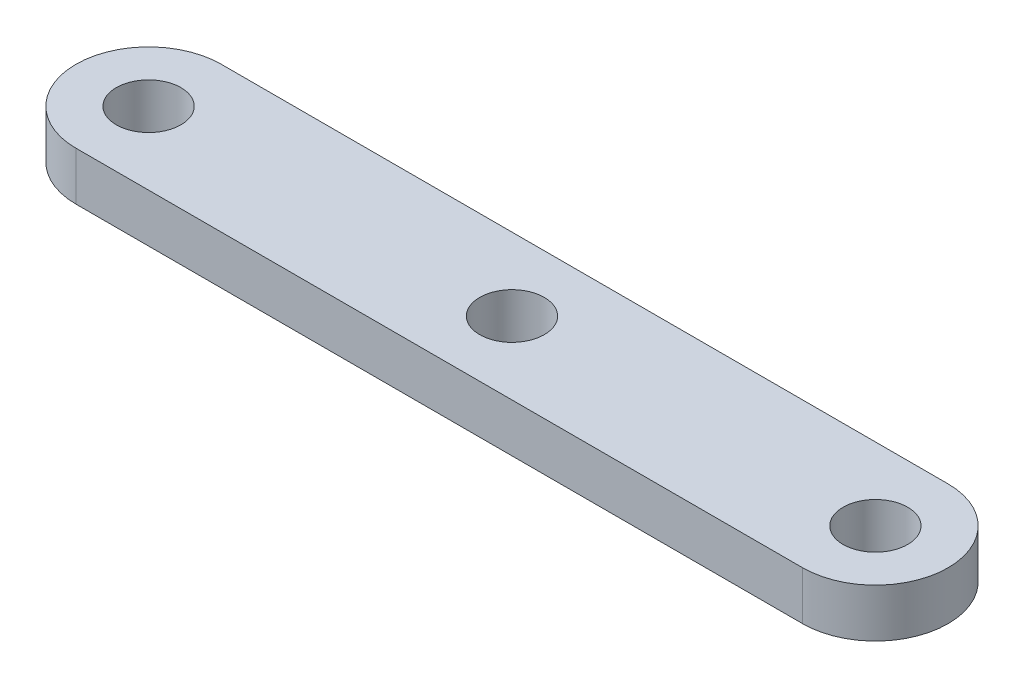
ISO-10303-21;
HEADER;
FILE_DESCRIPTION(('STEP AP214'),'2;1');
FILE_NAME('part.step','',(''),(''),'','','');
FILE_SCHEMA(('AUTOMOTIVE_DESIGN { 1 0 10303 214 1 1 1 1 }'));
ENDSEC;
DATA;
#1=APPLICATION_CONTEXT('core data for automotive mechanical design processes');
#2=APPLICATION_PROTOCOL_DEFINITION('international standard','automotive_design',2000,#1);
#3=PRODUCT_CONTEXT('',#1,'mechanical');
#4=PRODUCT('Part','Part','',(#3));
#5=PRODUCT_RELATED_PRODUCT_CATEGORY('part','',(#4));
#6=PRODUCT_DEFINITION_FORMATION('','',#4);
#7=PRODUCT_DEFINITION_CONTEXT('part definition',#1,'design');
#8=PRODUCT_DEFINITION('design','',#6,#7);
#9=PRODUCT_DEFINITION_SHAPE('','',#8);
#10=(LENGTH_UNIT() NAMED_UNIT(*) SI_UNIT(.MILLI.,.METRE.));
#11=(NAMED_UNIT(*) PLANE_ANGLE_UNIT() SI_UNIT($,.RADIAN.));
#12=(NAMED_UNIT(*) SI_UNIT($,.STERADIAN.) SOLID_ANGLE_UNIT());
#13=UNCERTAINTY_MEASURE_WITH_UNIT(LENGTH_MEASURE(1.E-05),#10,'distance_accuracy_value','');
#14=(GEOMETRIC_REPRESENTATION_CONTEXT(3) GLOBAL_UNCERTAINTY_ASSIGNED_CONTEXT((#13)) GLOBAL_UNIT_ASSIGNED_CONTEXT((#10,
#11,#12)) REPRESENTATION_CONTEXT('',''));
#15=CARTESIAN_POINT('',(0.,0.,0.));
#16=DIRECTION('',(0.,0.,1.));
#17=DIRECTION('',(1.,0.,0.));
#18=AXIS2_PLACEMENT_3D('',#15,#16,#17);
#19=CARTESIAN_POINT('',(0.,6.,-9.));
#20=DIRECTION('',(0.,-1.,0.));
#21=DIRECTION('',(0.,0.,-1.));
#22=AXIS2_PLACEMENT_3D('',#19,#20,#21);
#23=CYLINDRICAL_SURFACE('',#22,9.);
#24=CARTESIAN_POINT('',(0.,0.,-9.));
#25=DIRECTION('',(0.,1.,0.));
#26=DIRECTION('',(0.,0.,-1.));
#27=AXIS2_PLACEMENT_3D('',#24,#25,#26);
#28=CIRCLE('',#27,9.);
#29=CARTESIAN_POINT('',(0.,0.,-18.));
#30=VERTEX_POINT('',#29);
#31=CARTESIAN_POINT('',(0.,0.,0.));
#32=VERTEX_POINT('',#31);
#33=EDGE_CURVE('E111',#30,#32,#28,.T.);
#34=ORIENTED_EDGE('',*,*,#33,.T.);
#35=DIRECTION('',(0.,-1.,0.));
#36=VECTOR('',#35,1.);
#37=CARTESIAN_POINT('',(0.,6.,0.));
#38=LINE('',#37,#36);
#39=CARTESIAN_POINT('',(0.,6.,0.));
#40=VERTEX_POINT('',#39);
#41=EDGE_CURVE('E11',#40,#32,#38,.T.);
#42=ORIENTED_EDGE('',*,*,#41,.F.);
#43=CARTESIAN_POINT('',(0.,6.,-9.));
#44=DIRECTION('',(0.,1.,0.));
#45=DIRECTION('',(0.,0.,-1.));
#46=AXIS2_PLACEMENT_3D('',#43,#44,#45);
#47=CIRCLE('',#46,9.);
#48=CARTESIAN_POINT('',(0.,6.,-18.));
#49=VERTEX_POINT('',#48);
#50=EDGE_CURVE('E95',#49,#40,#47,.T.);
#51=ORIENTED_EDGE('',*,*,#50,.F.);
#52=DIRECTION('',(0.,-1.,0.));
#53=VECTOR('',#52,1.);
#54=CARTESIAN_POINT('',(0.,6.,-18.));
#55=LINE('',#54,#53);
#56=EDGE_CURVE('E107',#49,#30,#55,.T.);
#57=ORIENTED_EDGE('',*,*,#56,.T.);
#58=EDGE_LOOP('',(#34,#42,#51,#57));
#59=FACE_BOUND('',#58,.T.);
#60=ADVANCED_FACE('F43',(#59),#23,.T.);
#61=CARTESIAN_POINT('',(0.,6.,0.));
#62=DIRECTION('',(0.,0.,-1.));
#63=DIRECTION('',(-1.,0.,0.));
#64=AXIS2_PLACEMENT_3D('',#61,#62,#63);
#65=PLANE('',#64);
#66=DIRECTION('',(1.,0.,0.));
#67=VECTOR('',#66,1.);
#68=CARTESIAN_POINT('',(0.,0.,0.));
#69=LINE('',#68,#67);
#70=CARTESIAN_POINT('',(90.,0.,0.));
#71=VERTEX_POINT('',#70);
#72=EDGE_CURVE('E100',#32,#71,#69,.T.);
#73=ORIENTED_EDGE('',*,*,#72,.T.);
#74=DIRECTION('',(0.,-1.,0.));
#75=VECTOR('',#74,1.);
#76=CARTESIAN_POINT('',(90.,6.,0.));
#77=LINE('',#76,#75);
#78=CARTESIAN_POINT('',(90.,6.,0.));
#79=VERTEX_POINT('',#78);
#80=EDGE_CURVE('E52',#79,#71,#77,.T.);
#81=ORIENTED_EDGE('',*,*,#80,.F.);
#82=DIRECTION('',(1.,0.,0.));
#83=VECTOR('',#82,1.);
#84=CARTESIAN_POINT('',(0.,6.,0.));
#85=LINE('',#84,#83);
#86=EDGE_CURVE('E90',#40,#79,#85,.T.);
#87=ORIENTED_EDGE('',*,*,#86,.F.);
#88=ORIENTED_EDGE('',*,*,#41,.T.);
#89=EDGE_LOOP('',(#73,#81,#87,#88));
#90=FACE_BOUND('',#89,.T.);
#91=ADVANCED_FACE('F99',(#90),#65,.F.);
#92=CARTESIAN_POINT('',(90.,6.,-9.));
#93=DIRECTION('',(0.,-1.,0.));
#94=DIRECTION('',(0.,0.,-1.));
#95=AXIS2_PLACEMENT_3D('',#92,#93,#94);
#96=CYLINDRICAL_SURFACE('',#95,9.);
#97=CARTESIAN_POINT('',(90.,0.,-9.));
#98=DIRECTION('',(0.,1.,0.));
#99=DIRECTION('',(0.,0.,1.));
#100=AXIS2_PLACEMENT_3D('',#97,#98,#99);
#101=CIRCLE('',#100,9.);
#102=CARTESIAN_POINT('',(90.,0.,-18.));
#103=VERTEX_POINT('',#102);
#104=EDGE_CURVE('E77',#71,#103,#101,.T.);
#105=ORIENTED_EDGE('',*,*,#104,.T.);
#106=DIRECTION('',(0.,-1.,0.));
#107=VECTOR('',#106,1.);
#108=CARTESIAN_POINT('',(90.,6.,-18.));
#109=LINE('',#108,#107);
#110=CARTESIAN_POINT('',(90.,6.,-18.));
#111=VERTEX_POINT('',#110);
#112=EDGE_CURVE('E102',#111,#103,#109,.T.);
#113=ORIENTED_EDGE('',*,*,#112,.F.);
#114=CARTESIAN_POINT('',(90.,6.,-9.));
#115=DIRECTION('',(0.,1.,0.));
#116=DIRECTION('',(0.,0.,1.));
#117=AXIS2_PLACEMENT_3D('',#114,#115,#116);
#118=CIRCLE('',#117,9.);
#119=EDGE_CURVE('E93',#79,#111,#118,.T.);
#120=ORIENTED_EDGE('',*,*,#119,.F.);
#121=ORIENTED_EDGE('',*,*,#80,.T.);
#122=EDGE_LOOP('',(#105,#113,#120,#121));
#123=FACE_BOUND('',#122,.T.);
#124=ADVANCED_FACE('F103',(#123),#96,.T.);
#125=CARTESIAN_POINT('',(0.,6.,-18.));
#126=DIRECTION('',(0.,0.,1.));
#127=DIRECTION('',(1.,0.,0.));
#128=AXIS2_PLACEMENT_3D('',#125,#126,#127);
#129=PLANE('',#128);
#130=DIRECTION('',(-1.,0.,0.));
#131=VECTOR('',#130,1.);
#132=CARTESIAN_POINT('',(0.,0.,-18.));
#133=LINE('',#132,#131);
#134=EDGE_CURVE('E83',#103,#30,#133,.T.);
#135=ORIENTED_EDGE('',*,*,#134,.T.);
#136=ORIENTED_EDGE('',*,*,#56,.F.);
#137=DIRECTION('',(-1.,0.,0.));
#138=VECTOR('',#137,1.);
#139=CARTESIAN_POINT('',(0.,6.,-18.));
#140=LINE('',#139,#138);
#141=EDGE_CURVE('E60',#111,#49,#140,.T.);
#142=ORIENTED_EDGE('',*,*,#141,.F.);
#143=ORIENTED_EDGE('',*,*,#112,.T.);
#144=EDGE_LOOP('',(#135,#136,#142,#143));
#145=FACE_BOUND('',#144,.T.);
#146=ADVANCED_FACE('F125',(#145),#129,.F.);
#147=CARTESIAN_POINT('',(0.,6.,-9.));
#148=DIRECTION('',(0.,-1.,0.));
#149=DIRECTION('',(0.,0.,-1.));
#150=AXIS2_PLACEMENT_3D('',#147,#148,#149);
#151=PLANE('',#150);
#152=CARTESIAN_POINT('',(0.,6.,-9.));
#153=DIRECTION('',(0.,-1.,0.));
#154=DIRECTION('',(0.,0.,-1.));
#155=AXIS2_PLACEMENT_3D('',#152,#153,#154);
#156=CIRCLE('',#155,4.);
#157=CARTESIAN_POINT('',(0.,6.,-13.));
#158=VERTEX_POINT('',#157);
#159=EDGE_CURVE('E115',#158,#158,#156,.T.);
#160=ORIENTED_EDGE('',*,*,#159,.T.);
#161=EDGE_LOOP('',(#160));
#162=FACE_BOUND('',#161,.T.);
#163=CARTESIAN_POINT('',(45.,6.,-8.99999999999999));
#164=DIRECTION('',(0.,-1.,0.));
#165=DIRECTION('',(0.,0.,-1.));
#166=AXIS2_PLACEMENT_3D('',#163,#164,#165);
#167=CIRCLE('',#166,4.00000000000001);
#168=CARTESIAN_POINT('',(45.,6.,-13.));
#169=VERTEX_POINT('',#168);
#170=EDGE_CURVE('E140',#169,#169,#167,.T.);
#171=ORIENTED_EDGE('',*,*,#170,.T.);
#172=EDGE_LOOP('',(#171));
#173=FACE_BOUND('',#172,.T.);
#174=CARTESIAN_POINT('',(90.,6.,-8.99999999999999));
#175=DIRECTION('',(0.,-1.,0.));
#176=DIRECTION('',(0.,0.,1.));
#177=AXIS2_PLACEMENT_3D('',#174,#175,#176);
#178=CIRCLE('',#177,4.00000000000001);
#179=CARTESIAN_POINT('',(90.,6.,-4.99999999999998));
#180=VERTEX_POINT('',#179);
#181=EDGE_CURVE('E132',#180,#180,#178,.T.);
#182=ORIENTED_EDGE('',*,*,#181,.T.);
#183=EDGE_LOOP('',(#182));
#184=FACE_BOUND('',#183,.T.);
#185=ORIENTED_EDGE('',*,*,#50,.T.);
#186=ORIENTED_EDGE('',*,*,#86,.T.);
#187=ORIENTED_EDGE('',*,*,#119,.T.);
#188=ORIENTED_EDGE('',*,*,#141,.T.);
#189=EDGE_LOOP('',(#185,#186,#187,#188));
#190=FACE_BOUND('',#189,.T.);
#191=ADVANCED_FACE('F91',(#162,#173,#184,#190),#151,.F.);
#192=CARTESIAN_POINT('',(0.,0.,-9.));
#193=DIRECTION('',(0.,-1.,0.));
#194=DIRECTION('',(0.,0.,-1.));
#195=AXIS2_PLACEMENT_3D('',#192,#193,#194);
#196=PLANE('',#195);
#197=CARTESIAN_POINT('',(0.,0.,-9.));
#198=DIRECTION('',(0.,-1.,0.));
#199=DIRECTION('',(0.,0.,-1.));
#200=AXIS2_PLACEMENT_3D('',#197,#198,#199);
#201=CIRCLE('',#200,4.);
#202=CARTESIAN_POINT('',(0.,0.,-13.));
#203=VERTEX_POINT('',#202);
#204=EDGE_CURVE('E148',#203,#203,#201,.T.);
#205=ORIENTED_EDGE('',*,*,#204,.F.);
#206=EDGE_LOOP('',(#205));
#207=FACE_BOUND('',#206,.T.);
#208=CARTESIAN_POINT('',(45.,0.,-8.99999999999999));
#209=DIRECTION('',(0.,-1.,0.));
#210=DIRECTION('',(0.,0.,-1.));
#211=AXIS2_PLACEMENT_3D('',#208,#209,#210);
#212=CIRCLE('',#211,4.00000000000001);
#213=CARTESIAN_POINT('',(45.,0.,-13.));
#214=VERTEX_POINT('',#213);
#215=EDGE_CURVE('E144',#214,#214,#212,.T.);
#216=ORIENTED_EDGE('',*,*,#215,.F.);
#217=EDGE_LOOP('',(#216));
#218=FACE_BOUND('',#217,.T.);
#219=CARTESIAN_POINT('',(90.,0.,-8.99999999999999));
#220=DIRECTION('',(0.,-1.,0.));
#221=DIRECTION('',(0.,0.,1.));
#222=AXIS2_PLACEMENT_3D('',#219,#220,#221);
#223=CIRCLE('',#222,4.00000000000001);
#224=CARTESIAN_POINT('',(90.,0.,-4.99999999999998));
#225=VERTEX_POINT('',#224);
#226=EDGE_CURVE('E136',#225,#225,#223,.T.);
#227=ORIENTED_EDGE('',*,*,#226,.F.);
#228=EDGE_LOOP('',(#227));
#229=FACE_BOUND('',#228,.T.);
#230=ORIENTED_EDGE('',*,*,#33,.F.);
#231=ORIENTED_EDGE('',*,*,#134,.F.);
#232=ORIENTED_EDGE('',*,*,#104,.F.);
#233=ORIENTED_EDGE('',*,*,#72,.F.);
#234=EDGE_LOOP('',(#230,#231,#232,#233));
#235=FACE_BOUND('',#234,.T.);
#236=ADVANCED_FACE('F128',(#207,#218,#229,#235),#196,.T.);
#237=CARTESIAN_POINT('',(90.,6.,-8.99999999999999));
#238=DIRECTION('',(0.,-1.,0.));
#239=DIRECTION('',(0.,0.,-1.));
#240=AXIS2_PLACEMENT_3D('',#237,#238,#239);
#241=CYLINDRICAL_SURFACE('',#240,4.00000000000001);
#242=ORIENTED_EDGE('',*,*,#181,.F.);
#243=EDGE_LOOP('',(#242));
#244=FACE_BOUND('',#243,.T.);
#245=ORIENTED_EDGE('',*,*,#226,.T.);
#246=EDGE_LOOP('',(#245));
#247=FACE_BOUND('',#246,.T.);
#248=ADVANCED_FACE('F167',(#244,#247),#241,.F.);
#249=CARTESIAN_POINT('',(45.,6.,-8.99999999999999));
#250=DIRECTION('',(0.,-1.,0.));
#251=DIRECTION('',(0.,0.,-1.));
#252=AXIS2_PLACEMENT_3D('',#249,#250,#251);
#253=CYLINDRICAL_SURFACE('',#252,4.00000000000001);
#254=ORIENTED_EDGE('',*,*,#170,.F.);
#255=EDGE_LOOP('',(#254));
#256=FACE_BOUND('',#255,.T.);
#257=ORIENTED_EDGE('',*,*,#215,.T.);
#258=EDGE_LOOP('',(#257));
#259=FACE_BOUND('',#258,.T.);
#260=ADVANCED_FACE('F161',(#256,#259),#253,.F.);
#261=CARTESIAN_POINT('',(0.,6.,-9.));
#262=DIRECTION('',(0.,-1.,0.));
#263=DIRECTION('',(0.,0.,-1.));
#264=AXIS2_PLACEMENT_3D('',#261,#262,#263);
#265=CYLINDRICAL_SURFACE('',#264,4.);
#266=ORIENTED_EDGE('',*,*,#159,.F.);
#267=EDGE_LOOP('',(#266));
#268=FACE_BOUND('',#267,.T.);
#269=ORIENTED_EDGE('',*,*,#204,.T.);
#270=EDGE_LOOP('',(#269));
#271=FACE_BOUND('',#270,.T.);
#272=ADVANCED_FACE('F158',(#268,#271),#265,.F.);
#273=CLOSED_SHELL('',(#60,#91,#124,#146,#191,#236,#248,#260,#272));
#274=MANIFOLD_SOLID_BREP('B2',#273);
#275=ADVANCED_BREP_SHAPE_REPRESENTATION('',(#18,#274),#14);
#276=SHAPE_DEFINITION_REPRESENTATION(#9,#275);
ENDSEC;
END-ISO-10303-21;
